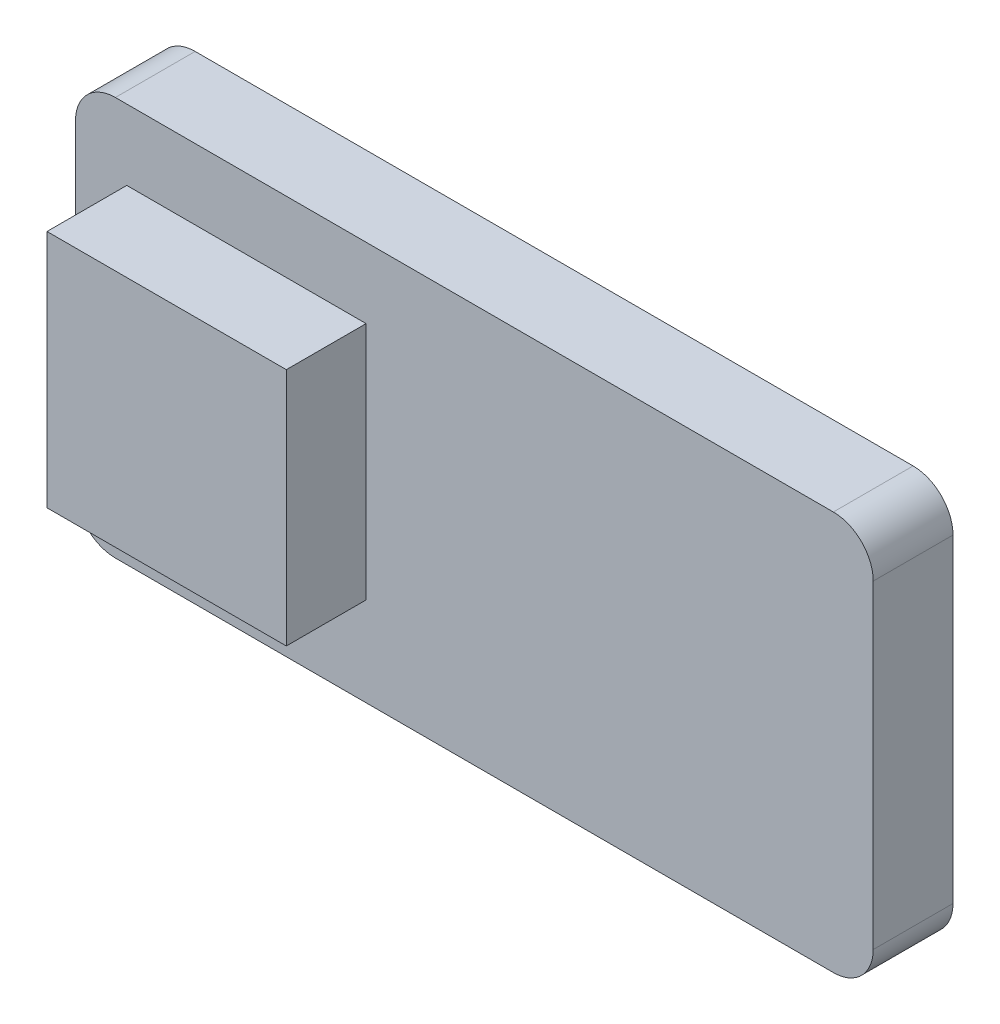
ISO-10303-21;
HEADER;
FILE_DESCRIPTION(('STEP AP214'),'2;1');
FILE_NAME('part.step','',(''),(''),'','','');
FILE_SCHEMA(('AUTOMOTIVE_DESIGN { 1 0 10303 214 1 1 1 1 }'));
ENDSEC;
DATA;
#1=APPLICATION_CONTEXT('core data for automotive mechanical design processes');
#2=APPLICATION_PROTOCOL_DEFINITION('international standard','automotive_design',2000,#1);
#3=PRODUCT_CONTEXT('',#1,'mechanical');
#4=PRODUCT('Part','Part','',(#3));
#5=PRODUCT_RELATED_PRODUCT_CATEGORY('part','',(#4));
#6=PRODUCT_DEFINITION_FORMATION('','',#4);
#7=PRODUCT_DEFINITION_CONTEXT('part definition',#1,'design');
#8=PRODUCT_DEFINITION('design','',#6,#7);
#9=PRODUCT_DEFINITION_SHAPE('','',#8);
#10=(LENGTH_UNIT() NAMED_UNIT(*) SI_UNIT(.MILLI.,.METRE.));
#11=(NAMED_UNIT(*) PLANE_ANGLE_UNIT() SI_UNIT($,.RADIAN.));
#12=(NAMED_UNIT(*) SI_UNIT($,.STERADIAN.) SOLID_ANGLE_UNIT());
#13=UNCERTAINTY_MEASURE_WITH_UNIT(LENGTH_MEASURE(1.E-05),#10,'distance_accuracy_value','');
#14=(GEOMETRIC_REPRESENTATION_CONTEXT(3) GLOBAL_UNCERTAINTY_ASSIGNED_CONTEXT((#13)) GLOBAL_UNIT_ASSIGNED_CONTEXT((#10,
#11,#12)) REPRESENTATION_CONTEXT('',''));
#15=CARTESIAN_POINT('',(0.,0.,0.));
#16=DIRECTION('',(0.,0.,1.));
#17=DIRECTION('',(1.,0.,0.));
#18=AXIS2_PLACEMENT_3D('',#15,#16,#17);
#19=CARTESIAN_POINT('',(0.,0.,2.));
#20=DIRECTION('',(0.,0.,1.));
#21=DIRECTION('',(1.,0.,0.));
#22=AXIS2_PLACEMENT_3D('',#19,#20,#21);
#23=PLANE('',#22);
#24=DIRECTION('',(0.,-1.,0.));
#25=VECTOR('',#24,1.);
#26=CARTESIAN_POINT('',(-10.,-22.096458497182,2.));
#27=LINE('',#26,#25);
#28=CARTESIAN_POINT('',(-10.,-23.096458497182,2.));
#29=VERTEX_POINT('',#28);
#30=CARTESIAN_POINT('',(-10.,-31.096458497182,2.));
#31=VERTEX_POINT('',#30);
#32=EDGE_CURVE('E157',#29,#31,#27,.T.);
#33=ORIENTED_EDGE('',*,*,#32,.T.);
#34=CARTESIAN_POINT('',(-9.,-31.096458497182,2.));
#35=DIRECTION('',(0.,0.,1.));
#36=DIRECTION('',(1.,0.,0.));
#37=AXIS2_PLACEMENT_3D('',#34,#35,#36);
#38=CIRCLE('',#37,1.);
#39=CARTESIAN_POINT('',(-9.,-32.096458497182,2.));
#40=VERTEX_POINT('',#39);
#41=EDGE_CURVE('E199',#31,#40,#38,.T.);
#42=ORIENTED_EDGE('',*,*,#41,.T.);
#43=DIRECTION('',(1.,0.,0.));
#44=VECTOR('',#43,1.);
#45=CARTESIAN_POINT('',(-10.,-32.096458497182,2.));
#46=LINE('',#45,#44);
#47=CARTESIAN_POINT('',(9.00000000000001,-32.096458497182,2.));
#48=VERTEX_POINT('',#47);
#49=EDGE_CURVE('E160',#40,#48,#46,.T.);
#50=ORIENTED_EDGE('',*,*,#49,.T.);
#51=CARTESIAN_POINT('',(9.,-31.096458497182,2.));
#52=DIRECTION('',(0.,0.,1.));
#53=DIRECTION('',(1.,0.,0.));
#54=AXIS2_PLACEMENT_3D('',#51,#52,#53);
#55=CIRCLE('',#54,1.);
#56=CARTESIAN_POINT('',(10.,-31.096458497182,2.));
#57=VERTEX_POINT('',#56);
#58=EDGE_CURVE('E195',#48,#57,#55,.T.);
#59=ORIENTED_EDGE('',*,*,#58,.T.);
#60=DIRECTION('',(0.,1.,0.));
#61=VECTOR('',#60,1.);
#62=CARTESIAN_POINT('',(10.,-22.096458497182,2.));
#63=LINE('',#62,#61);
#64=CARTESIAN_POINT('',(10.,-23.096458497182,2.));
#65=VERTEX_POINT('',#64);
#66=EDGE_CURVE('E164',#57,#65,#63,.T.);
#67=ORIENTED_EDGE('',*,*,#66,.T.);
#68=CARTESIAN_POINT('',(9.,-23.096458497182,2.));
#69=DIRECTION('',(0.,0.,1.));
#70=DIRECTION('',(1.,0.,0.));
#71=AXIS2_PLACEMENT_3D('',#68,#69,#70);
#72=CIRCLE('',#71,1.);
#73=CARTESIAN_POINT('',(9.,-22.096458497182,2.));
#74=VERTEX_POINT('',#73);
#75=EDGE_CURVE('E193',#65,#74,#72,.T.);
#76=ORIENTED_EDGE('',*,*,#75,.T.);
#77=DIRECTION('',(-1.,0.,0.));
#78=VECTOR('',#77,1.);
#79=CARTESIAN_POINT('',(-10.,-22.096458497182,2.));
#80=LINE('',#79,#78);
#81=CARTESIAN_POINT('',(-9.,-22.096458497182,2.));
#82=VERTEX_POINT('',#81);
#83=EDGE_CURVE('E167',#74,#82,#80,.T.);
#84=ORIENTED_EDGE('',*,*,#83,.T.);
#85=CARTESIAN_POINT('',(-9.,-23.096458497182,2.));
#86=DIRECTION('',(0.,0.,1.));
#87=DIRECTION('',(1.,0.,0.));
#88=AXIS2_PLACEMENT_3D('',#85,#86,#87);
#89=CIRCLE('',#88,1.);
#90=EDGE_CURVE('E197',#82,#29,#89,.T.);
#91=ORIENTED_EDGE('',*,*,#90,.T.);
#92=EDGE_LOOP('',(#33,#42,#50,#59,#67,#76,#84,#91));
#93=FACE_BOUND('',#92,.T.);
#94=DIRECTION('',(-1.,0.,0.));
#95=VECTOR('',#94,1.);
#96=CARTESIAN_POINT('',(-2.7144809752976,-23.8629570064577,2.));
#97=LINE('',#96,#95);
#98=CARTESIAN_POINT('',(-2.7144809752976,-23.8629570064577,2.));
#99=VERTEX_POINT('',#98);
#100=CARTESIAN_POINT('',(-8.7144809752976,-23.8629570064577,2.));
#101=VERTEX_POINT('',#100);
#102=EDGE_CURVE('E337',#99,#101,#97,.T.);
#103=ORIENTED_EDGE('',*,*,#102,.F.);
#104=DIRECTION('',(0.,1.,0.));
#105=VECTOR('',#104,1.);
#106=CARTESIAN_POINT('',(-2.7144809752976,-23.8629570064577,2.));
#107=LINE('',#106,#105);
#108=CARTESIAN_POINT('',(-2.7144809752976,-29.8629570064577,2.));
#109=VERTEX_POINT('',#108);
#110=EDGE_CURVE('E147',#109,#99,#107,.T.);
#111=ORIENTED_EDGE('',*,*,#110,.F.);
#112=DIRECTION('',(1.,0.,0.));
#113=VECTOR('',#112,1.);
#114=CARTESIAN_POINT('',(-2.7144809752976,-29.8629570064577,2.));
#115=LINE('',#114,#113);
#116=CARTESIAN_POINT('',(-8.7144809752976,-29.8629570064577,2.));
#117=VERTEX_POINT('',#116);
#118=EDGE_CURVE('E143',#117,#109,#115,.T.);
#119=ORIENTED_EDGE('',*,*,#118,.F.);
#120=DIRECTION('',(0.,-1.,0.));
#121=VECTOR('',#120,1.);
#122=CARTESIAN_POINT('',(-8.7144809752976,-23.8629570064577,2.));
#123=LINE('',#122,#121);
#124=EDGE_CURVE('E334',#101,#117,#123,.T.);
#125=ORIENTED_EDGE('',*,*,#124,.F.);
#126=EDGE_LOOP('',(#103,#111,#119,#125));
#127=FACE_BOUND('',#126,.T.);
#128=ADVANCED_FACE('F33',(#93,#127),#23,.T.);
#129=CARTESIAN_POINT('',(-10.,-22.096458497182,2.));
#130=DIRECTION('',(1.,0.,0.));
#131=DIRECTION('',(0.,1.,0.));
#132=AXIS2_PLACEMENT_3D('',#129,#130,#131);
#133=PLANE('',#132);
#134=DIRECTION('',(0.,-1.,0.));
#135=VECTOR('',#134,1.);
#136=CARTESIAN_POINT('',(-10.,-22.096458497182,0.));
#137=LINE('',#136,#135);
#138=CARTESIAN_POINT('',(-10.,-23.096458497182,0.));
#139=VERTEX_POINT('',#138);
#140=CARTESIAN_POINT('',(-10.,-31.096458497182,0.));
#141=VERTEX_POINT('',#140);
#142=EDGE_CURVE('E149',#139,#141,#137,.T.);
#143=ORIENTED_EDGE('',*,*,#142,.T.);
#144=DIRECTION('',(0.,0.,-1.));
#145=VECTOR('',#144,1.);
#146=CARTESIAN_POINT('',(-10.,-31.096458497182,2.));
#147=LINE('',#146,#145);
#148=EDGE_CURVE('E191',#141,#31,#147,.F.);
#149=ORIENTED_EDGE('',*,*,#148,.T.);
#150=ORIENTED_EDGE('',*,*,#32,.F.);
#151=DIRECTION('',(0.,0.,-1.));
#152=VECTOR('',#151,1.);
#153=CARTESIAN_POINT('',(-10.,-23.096458497182,2.));
#154=LINE('',#153,#152);
#155=EDGE_CURVE('E188',#29,#139,#154,.T.);
#156=ORIENTED_EDGE('',*,*,#155,.T.);
#157=EDGE_LOOP('',(#143,#149,#150,#156));
#158=FACE_BOUND('',#157,.T.);
#159=ADVANCED_FACE('F228',(#158),#133,.F.);
#160=CARTESIAN_POINT('',(-10.,-32.096458497182,2.));
#161=DIRECTION('',(0.,1.,0.));
#162=DIRECTION('',(0.,0.,1.));
#163=AXIS2_PLACEMENT_3D('',#160,#161,#162);
#164=PLANE('',#163);
#165=ORIENTED_EDGE('',*,*,#49,.F.);
#166=DIRECTION('',(0.,0.,-1.));
#167=VECTOR('',#166,1.);
#168=CARTESIAN_POINT('',(-9.,-32.096458497182,2.));
#169=LINE('',#168,#167);
#170=CARTESIAN_POINT('',(-9.,-32.096458497182,0.));
#171=VERTEX_POINT('',#170);
#172=EDGE_CURVE('E177',#40,#171,#169,.T.);
#173=ORIENTED_EDGE('',*,*,#172,.T.);
#174=DIRECTION('',(1.,0.,0.));
#175=VECTOR('',#174,1.);
#176=CARTESIAN_POINT('',(-10.,-32.096458497182,0.));
#177=LINE('',#176,#175);
#178=CARTESIAN_POINT('',(9.00000000000001,-32.096458497182,0.));
#179=VERTEX_POINT('',#178);
#180=EDGE_CURVE('E152',#171,#179,#177,.T.);
#181=ORIENTED_EDGE('',*,*,#180,.T.);
#182=DIRECTION('',(0.,0.,-1.));
#183=VECTOR('',#182,1.);
#184=CARTESIAN_POINT('',(9.00000000000001,-32.096458497182,2.));
#185=LINE('',#184,#183);
#186=EDGE_CURVE('E168',#179,#48,#185,.F.);
#187=ORIENTED_EDGE('',*,*,#186,.T.);
#188=EDGE_LOOP('',(#165,#173,#181,#187));
#189=FACE_BOUND('',#188,.T.);
#190=ADVANCED_FACE('F236',(#189),#164,.F.);
#191=CARTESIAN_POINT('',(10.,-22.096458497182,2.));
#192=DIRECTION('',(-1.,0.,0.));
#193=DIRECTION('',(0.,-1.,0.));
#194=AXIS2_PLACEMENT_3D('',#191,#192,#193);
#195=PLANE('',#194);
#196=ORIENTED_EDGE('',*,*,#66,.F.);
#197=DIRECTION('',(0.,0.,-1.));
#198=VECTOR('',#197,1.);
#199=CARTESIAN_POINT('',(10.,-31.096458497182,2.));
#200=LINE('',#199,#198);
#201=CARTESIAN_POINT('',(10.,-31.096458497182,0.));
#202=VERTEX_POINT('',#201);
#203=EDGE_CURVE('E11',#57,#202,#200,.T.);
#204=ORIENTED_EDGE('',*,*,#203,.T.);
#205=DIRECTION('',(0.,1.,0.));
#206=VECTOR('',#205,1.);
#207=CARTESIAN_POINT('',(10.,-22.096458497182,0.));
#208=LINE('',#207,#206);
#209=CARTESIAN_POINT('',(10.,-23.096458497182,0.));
#210=VERTEX_POINT('',#209);
#211=EDGE_CURVE('E172',#202,#210,#208,.T.);
#212=ORIENTED_EDGE('',*,*,#211,.T.);
#213=DIRECTION('',(0.,0.,-1.));
#214=VECTOR('',#213,1.);
#215=CARTESIAN_POINT('',(10.,-23.096458497182,2.));
#216=LINE('',#215,#214);
#217=EDGE_CURVE('E41',#210,#65,#216,.F.);
#218=ORIENTED_EDGE('',*,*,#217,.T.);
#219=EDGE_LOOP('',(#196,#204,#212,#218));
#220=FACE_BOUND('',#219,.T.);
#221=ADVANCED_FACE('F207',(#220),#195,.F.);
#222=CARTESIAN_POINT('',(-10.,-22.096458497182,2.));
#223=DIRECTION('',(0.,-1.,0.));
#224=DIRECTION('',(0.,0.,-1.));
#225=AXIS2_PLACEMENT_3D('',#222,#223,#224);
#226=PLANE('',#225);
#227=DIRECTION('',(-1.,0.,0.));
#228=VECTOR('',#227,1.);
#229=CARTESIAN_POINT('',(-10.,-22.096458497182,0.));
#230=LINE('',#229,#228);
#231=CARTESIAN_POINT('',(9.,-22.096458497182,0.));
#232=VERTEX_POINT('',#231);
#233=CARTESIAN_POINT('',(-9.,-22.096458497182,0.));
#234=VERTEX_POINT('',#233);
#235=EDGE_CURVE('E161',#232,#234,#230,.T.);
#236=ORIENTED_EDGE('',*,*,#235,.T.);
#237=DIRECTION('',(0.,0.,-1.));
#238=VECTOR('',#237,1.);
#239=CARTESIAN_POINT('',(-9.,-22.096458497182,2.));
#240=LINE('',#239,#238);
#241=EDGE_CURVE('E56',#234,#82,#240,.F.);
#242=ORIENTED_EDGE('',*,*,#241,.T.);
#243=ORIENTED_EDGE('',*,*,#83,.F.);
#244=DIRECTION('',(0.,0.,-1.));
#245=VECTOR('',#244,1.);
#246=CARTESIAN_POINT('',(9.,-22.096458497182,2.));
#247=LINE('',#246,#245);
#248=EDGE_CURVE('E201',#74,#232,#247,.T.);
#249=ORIENTED_EDGE('',*,*,#248,.T.);
#250=EDGE_LOOP('',(#236,#242,#243,#249));
#251=FACE_BOUND('',#250,.T.);
#252=ADVANCED_FACE('F217',(#251),#226,.F.);
#253=CARTESIAN_POINT('',(0.,0.,0.));
#254=DIRECTION('',(0.,0.,1.));
#255=DIRECTION('',(1.,0.,0.));
#256=AXIS2_PLACEMENT_3D('',#253,#254,#255);
#257=PLANE('',#256);
#258=ORIENTED_EDGE('',*,*,#180,.F.);
#259=CARTESIAN_POINT('',(-9.,-31.096458497182,0.));
#260=DIRECTION('',(0.,0.,1.));
#261=DIRECTION('',(1.,0.,0.));
#262=AXIS2_PLACEMENT_3D('',#259,#260,#261);
#263=CIRCLE('',#262,1.);
#264=EDGE_CURVE('E186',#171,#141,#263,.F.);
#265=ORIENTED_EDGE('',*,*,#264,.T.);
#266=ORIENTED_EDGE('',*,*,#142,.F.);
#267=CARTESIAN_POINT('',(-9.,-23.096458497182,0.));
#268=DIRECTION('',(0.,0.,1.));
#269=DIRECTION('',(1.,0.,0.));
#270=AXIS2_PLACEMENT_3D('',#267,#268,#269);
#271=CIRCLE('',#270,1.);
#272=EDGE_CURVE('E184',#139,#234,#271,.F.);
#273=ORIENTED_EDGE('',*,*,#272,.T.);
#274=ORIENTED_EDGE('',*,*,#235,.F.);
#275=CARTESIAN_POINT('',(9.,-23.096458497182,0.));
#276=DIRECTION('',(0.,0.,1.));
#277=DIRECTION('',(1.,0.,0.));
#278=AXIS2_PLACEMENT_3D('',#275,#276,#277);
#279=CIRCLE('',#278,1.);
#280=EDGE_CURVE('E180',#232,#210,#279,.F.);
#281=ORIENTED_EDGE('',*,*,#280,.T.);
#282=ORIENTED_EDGE('',*,*,#211,.F.);
#283=CARTESIAN_POINT('',(9.,-31.096458497182,0.));
#284=DIRECTION('',(0.,0.,1.));
#285=DIRECTION('',(1.,0.,0.));
#286=AXIS2_PLACEMENT_3D('',#283,#284,#285);
#287=CIRCLE('',#286,1.);
#288=EDGE_CURVE('E182',#202,#179,#287,.F.);
#289=ORIENTED_EDGE('',*,*,#288,.T.);
#290=EDGE_LOOP('',(#258,#265,#266,#273,#274,#281,#282,#289));
#291=FACE_BOUND('',#290,.T.);
#292=ADVANCED_FACE('F220',(#291),#257,.F.);
#293=CARTESIAN_POINT('',(-9.,-31.096458497182,2.));
#294=DIRECTION('',(0.,0.,-1.));
#295=DIRECTION('',(-1.,0.,0.));
#296=AXIS2_PLACEMENT_3D('',#293,#294,#295);
#297=CYLINDRICAL_SURFACE('',#296,1.);
#298=ORIENTED_EDGE('',*,*,#41,.F.);
#299=ORIENTED_EDGE('',*,*,#148,.F.);
#300=ORIENTED_EDGE('',*,*,#264,.F.);
#301=ORIENTED_EDGE('',*,*,#172,.F.);
#302=EDGE_LOOP('',(#298,#299,#300,#301));
#303=FACE_BOUND('',#302,.T.);
#304=ADVANCED_FACE('F234',(#303),#297,.T.);
#305=CARTESIAN_POINT('',(-9.,-23.096458497182,2.));
#306=DIRECTION('',(0.,0.,-1.));
#307=DIRECTION('',(-1.,0.,0.));
#308=AXIS2_PLACEMENT_3D('',#305,#306,#307);
#309=CYLINDRICAL_SURFACE('',#308,1.);
#310=ORIENTED_EDGE('',*,*,#90,.F.);
#311=ORIENTED_EDGE('',*,*,#241,.F.);
#312=ORIENTED_EDGE('',*,*,#272,.F.);
#313=ORIENTED_EDGE('',*,*,#155,.F.);
#314=EDGE_LOOP('',(#310,#311,#312,#313));
#315=FACE_BOUND('',#314,.T.);
#316=ADVANCED_FACE('F225',(#315),#309,.T.);
#317=CARTESIAN_POINT('',(9.,-31.096458497182,2.));
#318=DIRECTION('',(0.,0.,-1.));
#319=DIRECTION('',(-1.,0.,0.));
#320=AXIS2_PLACEMENT_3D('',#317,#318,#319);
#321=CYLINDRICAL_SURFACE('',#320,1.);
#322=ORIENTED_EDGE('',*,*,#58,.F.);
#323=ORIENTED_EDGE('',*,*,#186,.F.);
#324=ORIENTED_EDGE('',*,*,#288,.F.);
#325=ORIENTED_EDGE('',*,*,#203,.F.);
#326=EDGE_LOOP('',(#322,#323,#324,#325));
#327=FACE_BOUND('',#326,.T.);
#328=ADVANCED_FACE('F239',(#327),#321,.T.);
#329=CARTESIAN_POINT('',(9.,-23.096458497182,2.));
#330=DIRECTION('',(0.,0.,-1.));
#331=DIRECTION('',(-1.,0.,0.));
#332=AXIS2_PLACEMENT_3D('',#329,#330,#331);
#333=CYLINDRICAL_SURFACE('',#332,1.);
#334=ORIENTED_EDGE('',*,*,#75,.F.);
#335=ORIENTED_EDGE('',*,*,#217,.F.);
#336=ORIENTED_EDGE('',*,*,#280,.F.);
#337=ORIENTED_EDGE('',*,*,#248,.F.);
#338=EDGE_LOOP('',(#334,#335,#336,#337));
#339=FACE_BOUND('',#338,.T.);
#340=ADVANCED_FACE('F35',(#339),#333,.T.);
#341=CARTESIAN_POINT('',(-2.7144809752976,-23.8629570064577,4.));
#342=DIRECTION('',(-1.,0.,0.));
#343=DIRECTION('',(0.,-1.,0.));
#344=AXIS2_PLACEMENT_3D('',#341,#342,#343);
#345=PLANE('',#344);
#346=ORIENTED_EDGE('',*,*,#110,.T.);
#347=DIRECTION('',(0.,0.,-1.));
#348=VECTOR('',#347,1.);
#349=CARTESIAN_POINT('',(-2.7144809752976,-23.8629570064577,4.));
#350=LINE('',#349,#348);
#351=CARTESIAN_POINT('',(-2.7144809752976,-23.8629570064577,4.));
#352=VERTEX_POINT('',#351);
#353=EDGE_CURVE('E128',#352,#99,#350,.T.);
#354=ORIENTED_EDGE('',*,*,#353,.F.);
#355=DIRECTION('',(0.,1.,0.));
#356=VECTOR('',#355,1.);
#357=CARTESIAN_POINT('',(-2.7144809752976,-23.8629570064577,4.));
#358=LINE('',#357,#356);
#359=CARTESIAN_POINT('',(-2.7144809752976,-29.8629570064577,4.));
#360=VERTEX_POINT('',#359);
#361=EDGE_CURVE('E135',#360,#352,#358,.T.);
#362=ORIENTED_EDGE('',*,*,#361,.F.);
#363=DIRECTION('',(0.,0.,-1.));
#364=VECTOR('',#363,1.);
#365=CARTESIAN_POINT('',(-2.7144809752976,-29.8629570064577,4.));
#366=LINE('',#365,#364);
#367=EDGE_CURVE('E332',#360,#109,#366,.T.);
#368=ORIENTED_EDGE('',*,*,#367,.T.);
#369=EDGE_LOOP('',(#346,#354,#362,#368));
#370=FACE_BOUND('',#369,.T.);
#371=ADVANCED_FACE('F145',(#370),#345,.F.);
#372=CARTESIAN_POINT('',(-2.7144809752976,-23.8629570064577,4.));
#373=DIRECTION('',(0.,-1.,0.));
#374=DIRECTION('',(0.,0.,-1.));
#375=AXIS2_PLACEMENT_3D('',#372,#373,#374);
#376=PLANE('',#375);
#377=ORIENTED_EDGE('',*,*,#102,.T.);
#378=DIRECTION('',(0.,0.,-1.));
#379=VECTOR('',#378,1.);
#380=CARTESIAN_POINT('',(-8.7144809752976,-23.8629570064577,4.));
#381=LINE('',#380,#379);
#382=CARTESIAN_POINT('',(-8.7144809752976,-23.8629570064577,4.));
#383=VERTEX_POINT('',#382);
#384=EDGE_CURVE('E131',#383,#101,#381,.T.);
#385=ORIENTED_EDGE('',*,*,#384,.F.);
#386=DIRECTION('',(-1.,0.,0.));
#387=VECTOR('',#386,1.);
#388=CARTESIAN_POINT('',(-2.7144809752976,-23.8629570064577,4.));
#389=LINE('',#388,#387);
#390=EDGE_CURVE('E124',#352,#383,#389,.T.);
#391=ORIENTED_EDGE('',*,*,#390,.F.);
#392=ORIENTED_EDGE('',*,*,#353,.T.);
#393=EDGE_LOOP('',(#377,#385,#391,#392));
#394=FACE_BOUND('',#393,.T.);
#395=ADVANCED_FACE('F126',(#394),#376,.F.);
#396=CARTESIAN_POINT('',(-8.7144809752976,-23.8629570064577,4.));
#397=DIRECTION('',(1.,0.,0.));
#398=DIRECTION('',(0.,0.,-1.));
#399=AXIS2_PLACEMENT_3D('',#396,#397,#398);
#400=PLANE('',#399);
#401=ORIENTED_EDGE('',*,*,#124,.T.);
#402=DIRECTION('',(0.,0.,-1.));
#403=VECTOR('',#402,1.);
#404=CARTESIAN_POINT('',(-8.7144809752976,-29.8629570064577,4.));
#405=LINE('',#404,#403);
#406=CARTESIAN_POINT('',(-8.7144809752976,-29.8629570064577,4.));
#407=VERTEX_POINT('',#406);
#408=EDGE_CURVE('E48',#407,#117,#405,.T.);
#409=ORIENTED_EDGE('',*,*,#408,.F.);
#410=DIRECTION('',(0.,-1.,0.));
#411=VECTOR('',#410,1.);
#412=CARTESIAN_POINT('',(-8.7144809752976,-23.8629570064577,4.));
#413=LINE('',#412,#411);
#414=EDGE_CURVE('E134',#383,#407,#413,.T.);
#415=ORIENTED_EDGE('',*,*,#414,.F.);
#416=ORIENTED_EDGE('',*,*,#384,.T.);
#417=EDGE_LOOP('',(#401,#409,#415,#416));
#418=FACE_BOUND('',#417,.T.);
#419=ADVANCED_FACE('F302',(#418),#400,.F.);
#420=CARTESIAN_POINT('',(-2.7144809752976,-29.8629570064577,4.));
#421=DIRECTION('',(0.,1.,0.));
#422=DIRECTION('',(0.,0.,1.));
#423=AXIS2_PLACEMENT_3D('',#420,#421,#422);
#424=PLANE('',#423);
#425=ORIENTED_EDGE('',*,*,#118,.T.);
#426=ORIENTED_EDGE('',*,*,#367,.F.);
#427=DIRECTION('',(1.,0.,0.));
#428=VECTOR('',#427,1.);
#429=CARTESIAN_POINT('',(-2.7144809752976,-29.8629570064577,4.));
#430=LINE('',#429,#428);
#431=EDGE_CURVE('E139',#407,#360,#430,.T.);
#432=ORIENTED_EDGE('',*,*,#431,.F.);
#433=ORIENTED_EDGE('',*,*,#408,.T.);
#434=EDGE_LOOP('',(#425,#426,#432,#433));
#435=FACE_BOUND('',#434,.T.);
#436=ADVANCED_FACE('F310',(#435),#424,.F.);
#437=CARTESIAN_POINT('',(0.,0.,4.));
#438=DIRECTION('',(0.,0.,-1.));
#439=DIRECTION('',(-1.,0.,0.));
#440=AXIS2_PLACEMENT_3D('',#437,#438,#439);
#441=PLANE('',#440);
#442=ORIENTED_EDGE('',*,*,#361,.T.);
#443=ORIENTED_EDGE('',*,*,#390,.T.);
#444=ORIENTED_EDGE('',*,*,#414,.T.);
#445=ORIENTED_EDGE('',*,*,#431,.T.);
#446=EDGE_LOOP('',(#442,#443,#444,#445));
#447=FACE_BOUND('',#446,.T.);
#448=ADVANCED_FACE('F138',(#447),#441,.F.);
#449=CLOSED_SHELL('',(#128,#159,#190,#221,#252,#292,#304,#316,#328,#340,#371,#395,#419,#436,#448));
#450=MANIFOLD_SOLID_BREP('B2',#449);
#451=ADVANCED_BREP_SHAPE_REPRESENTATION('',(#18,#450),#14);
#452=SHAPE_DEFINITION_REPRESENTATION(#9,#451);
ENDSEC;
END-ISO-10303-21;
